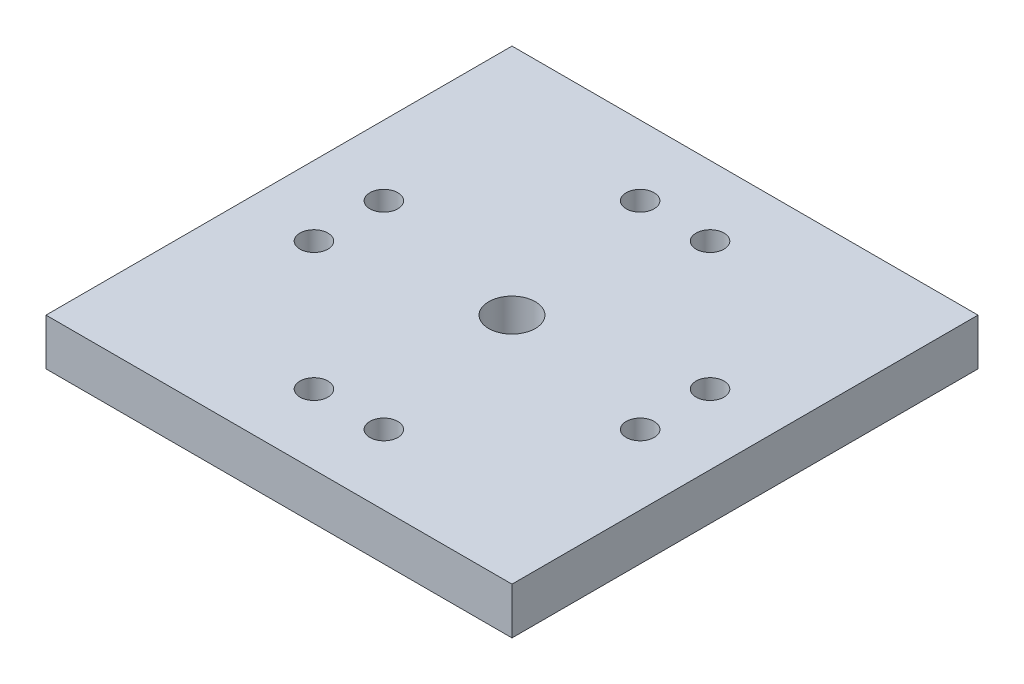
ISO-10303-21;
HEADER;
FILE_DESCRIPTION(('STEP AP214'),'2;1');
FILE_NAME('part.step','',(''),(''),'','','');
FILE_SCHEMA(('AUTOMOTIVE_DESIGN { 1 0 10303 214 1 1 1 1 }'));
ENDSEC;
DATA;
#1=APPLICATION_CONTEXT('core data for automotive mechanical design processes');
#2=APPLICATION_PROTOCOL_DEFINITION('international standard','automotive_design',2000,#1);
#3=PRODUCT_CONTEXT('',#1,'mechanical');
#4=PRODUCT('Part','Part','',(#3));
#5=PRODUCT_RELATED_PRODUCT_CATEGORY('part','',(#4));
#6=PRODUCT_DEFINITION_FORMATION('','',#4);
#7=PRODUCT_DEFINITION_CONTEXT('part definition',#1,'design');
#8=PRODUCT_DEFINITION('design','',#6,#7);
#9=PRODUCT_DEFINITION_SHAPE('','',#8);
#10=(LENGTH_UNIT() NAMED_UNIT(*) SI_UNIT(.MILLI.,.METRE.));
#11=(NAMED_UNIT(*) PLANE_ANGLE_UNIT() SI_UNIT($,.RADIAN.));
#12=(NAMED_UNIT(*) SI_UNIT($,.STERADIAN.) SOLID_ANGLE_UNIT());
#13=UNCERTAINTY_MEASURE_WITH_UNIT(LENGTH_MEASURE(1.E-05),#10,'distance_accuracy_value','');
#14=(GEOMETRIC_REPRESENTATION_CONTEXT(3) GLOBAL_UNCERTAINTY_ASSIGNED_CONTEXT((#13)) GLOBAL_UNIT_ASSIGNED_CONTEXT((#10,
#11,#12)) REPRESENTATION_CONTEXT('',''));
#15=CARTESIAN_POINT('',(0.,0.,0.));
#16=DIRECTION('',(0.,0.,1.));
#17=DIRECTION('',(1.,0.,0.));
#18=AXIS2_PLACEMENT_3D('',#15,#16,#17);
#19=CARTESIAN_POINT('',(0.,10.,0.));
#20=DIRECTION('',(0.,1.,0.));
#21=DIRECTION('',(0.,0.,1.));
#22=AXIS2_PLACEMENT_3D('',#19,#20,#21);
#23=PLANE('',#22);
#24=CARTESIAN_POINT('',(-35.0000000000001,10.,7.49999999999965));
#25=DIRECTION('',(0.,1.,0.));
#26=DIRECTION('',(0.,0.,1.));
#27=AXIS2_PLACEMENT_3D('',#24,#25,#26);
#28=CIRCLE('',#27,3.);
#29=CARTESIAN_POINT('',(-35.0000000000001,10.,10.4999999999996));
#30=VERTEX_POINT('',#29);
#31=EDGE_CURVE('E151',#30,#30,#28,.T.);
#32=ORIENTED_EDGE('',*,*,#31,.F.);
#33=EDGE_LOOP('',(#32));
#34=FACE_BOUND('',#33,.T.);
#35=CARTESIAN_POINT('',(7.49999999999977,10.,35.));
#36=DIRECTION('',(0.,1.,0.));
#37=DIRECTION('',(0.,0.,1.));
#38=AXIS2_PLACEMENT_3D('',#35,#36,#37);
#39=CIRCLE('',#38,3.);
#40=CARTESIAN_POINT('',(7.49999999999977,10.,38.0000000000001));
#41=VERTEX_POINT('',#40);
#42=EDGE_CURVE('E139',#41,#41,#39,.T.);
#43=ORIENTED_EDGE('',*,*,#42,.F.);
#44=EDGE_LOOP('',(#43));
#45=FACE_BOUND('',#44,.T.);
#46=CARTESIAN_POINT('',(35.,10.,-7.49999999999989));
#47=DIRECTION('',(0.,1.,0.));
#48=DIRECTION('',(0.,0.,1.));
#49=AXIS2_PLACEMENT_3D('',#46,#47,#48);
#50=CIRCLE('',#49,3.);
#51=CARTESIAN_POINT('',(35.,10.,-4.49999999999989));
#52=VERTEX_POINT('',#51);
#53=EDGE_CURVE('E127',#52,#52,#50,.T.);
#54=ORIENTED_EDGE('',*,*,#53,.F.);
#55=EDGE_LOOP('',(#54));
#56=FACE_BOUND('',#55,.T.);
#57=CARTESIAN_POINT('',(-7.50000000000001,10.,-35.));
#58=DIRECTION('',(0.,1.,0.));
#59=DIRECTION('',(0.,0.,1.));
#60=AXIS2_PLACEMENT_3D('',#57,#58,#59);
#61=CIRCLE('',#60,3.);
#62=CARTESIAN_POINT('',(-7.50000000000001,10.,-32.));
#63=VERTEX_POINT('',#62);
#64=EDGE_CURVE('E115',#63,#63,#61,.T.);
#65=ORIENTED_EDGE('',*,*,#64,.F.);
#66=EDGE_LOOP('',(#65));
#67=FACE_BOUND('',#66,.T.);
#68=DIRECTION('',(0.,0.,1.));
#69=VECTOR('',#68,1.);
#70=CARTESIAN_POINT('',(-50.,10.,50.));
#71=LINE('',#70,#69);
#72=CARTESIAN_POINT('',(-50.,10.,-50.));
#73=VERTEX_POINT('',#72);
#74=CARTESIAN_POINT('',(-50.,10.,50.));
#75=VERTEX_POINT('',#74);
#76=EDGE_CURVE('E85',#73,#75,#71,.T.);
#77=ORIENTED_EDGE('',*,*,#76,.T.);
#78=DIRECTION('',(1.,0.,0.));
#79=VECTOR('',#78,1.);
#80=CARTESIAN_POINT('',(50.,10.,50.));
#81=LINE('',#80,#79);
#82=CARTESIAN_POINT('',(50.,10.,50.));
#83=VERTEX_POINT('',#82);
#84=EDGE_CURVE('E80',#75,#83,#81,.T.);
#85=ORIENTED_EDGE('',*,*,#84,.T.);
#86=DIRECTION('',(0.,0.,-1.));
#87=VECTOR('',#86,1.);
#88=CARTESIAN_POINT('',(50.,10.,50.));
#89=LINE('',#88,#87);
#90=CARTESIAN_POINT('',(50.,10.,-50.));
#91=VERTEX_POINT('',#90);
#92=EDGE_CURVE('E83',#83,#91,#89,.T.);
#93=ORIENTED_EDGE('',*,*,#92,.T.);
#94=DIRECTION('',(-1.,0.,0.));
#95=VECTOR('',#94,1.);
#96=CARTESIAN_POINT('',(50.,10.,-50.));
#97=LINE('',#96,#95);
#98=EDGE_CURVE('E50',#91,#73,#97,.T.);
#99=ORIENTED_EDGE('',*,*,#98,.T.);
#100=EDGE_LOOP('',(#77,#85,#93,#99));
#101=FACE_BOUND('',#100,.T.);
#102=CARTESIAN_POINT('',(0.,10.,0.));
#103=DIRECTION('',(0.,1.,0.));
#104=DIRECTION('',(0.,0.,1.));
#105=AXIS2_PLACEMENT_3D('',#102,#103,#104);
#106=CIRCLE('',#105,5.);
#107=CARTESIAN_POINT('',(0.,10.,4.99999999999999));
#108=VERTEX_POINT('',#107);
#109=EDGE_CURVE('E100',#108,#108,#106,.T.);
#110=ORIENTED_EDGE('',*,*,#109,.F.);
#111=EDGE_LOOP('',(#110));
#112=FACE_BOUND('',#111,.T.);
#113=CARTESIAN_POINT('',(7.49999999999999,10.,-35.));
#114=DIRECTION('',(0.,1.,0.));
#115=DIRECTION('',(0.,0.,1.));
#116=AXIS2_PLACEMENT_3D('',#113,#114,#115);
#117=CIRCLE('',#116,3.);
#118=CARTESIAN_POINT('',(7.49999999999999,10.,-32.));
#119=VERTEX_POINT('',#118);
#120=EDGE_CURVE('E121',#119,#119,#117,.T.);
#121=ORIENTED_EDGE('',*,*,#120,.F.);
#122=EDGE_LOOP('',(#121));
#123=FACE_BOUND('',#122,.T.);
#124=CARTESIAN_POINT('',(35.,10.,7.50000000000011));
#125=DIRECTION('',(0.,1.,0.));
#126=DIRECTION('',(0.,0.,1.));
#127=AXIS2_PLACEMENT_3D('',#124,#125,#126);
#128=CIRCLE('',#127,3.);
#129=CARTESIAN_POINT('',(35.,10.,10.5000000000001));
#130=VERTEX_POINT('',#129);
#131=EDGE_CURVE('E133',#130,#130,#128,.T.);
#132=ORIENTED_EDGE('',*,*,#131,.F.);
#133=EDGE_LOOP('',(#132));
#134=FACE_BOUND('',#133,.T.);
#135=CARTESIAN_POINT('',(-7.50000000000023,10.,34.9999999999999));
#136=DIRECTION('',(0.,1.,0.));
#137=DIRECTION('',(0.,0.,1.));
#138=AXIS2_PLACEMENT_3D('',#135,#136,#137);
#139=CIRCLE('',#138,3.);
#140=CARTESIAN_POINT('',(-7.50000000000023,10.,37.9999999999999));
#141=VERTEX_POINT('',#140);
#142=EDGE_CURVE('E145',#141,#141,#139,.T.);
#143=ORIENTED_EDGE('',*,*,#142,.F.);
#144=EDGE_LOOP('',(#143));
#145=FACE_BOUND('',#144,.T.);
#146=CARTESIAN_POINT('',(-34.9999999999999,10.,-7.50000000000035));
#147=DIRECTION('',(0.,1.,0.));
#148=DIRECTION('',(0.,0.,1.));
#149=AXIS2_PLACEMENT_3D('',#146,#147,#148);
#150=CIRCLE('',#149,3.);
#151=CARTESIAN_POINT('',(-34.9999999999999,10.,-4.50000000000035));
#152=VERTEX_POINT('',#151);
#153=EDGE_CURVE('E157',#152,#152,#150,.T.);
#154=ORIENTED_EDGE('',*,*,#153,.F.);
#155=EDGE_LOOP('',(#154));
#156=FACE_BOUND('',#155,.T.);
#157=ADVANCED_FACE('F33',(#34,#45,#56,#67,#101,#112,#123,#134,#145,#156),#23,.T.);
#158=CARTESIAN_POINT('',(0.,0.,0.));
#159=DIRECTION('',(0.,1.,0.));
#160=DIRECTION('',(0.,0.,1.));
#161=AXIS2_PLACEMENT_3D('',#158,#159,#160);
#162=PLANE('',#161);
#163=DIRECTION('',(0.,0.,1.));
#164=VECTOR('',#163,1.);
#165=CARTESIAN_POINT('',(-50.,0.,50.));
#166=LINE('',#165,#164);
#167=CARTESIAN_POINT('',(-50.,0.,-50.));
#168=VERTEX_POINT('',#167);
#169=CARTESIAN_POINT('',(-50.,0.,50.));
#170=VERTEX_POINT('',#169);
#171=EDGE_CURVE('E97',#168,#170,#166,.T.);
#172=ORIENTED_EDGE('',*,*,#171,.F.);
#173=DIRECTION('',(-1.,0.,0.));
#174=VECTOR('',#173,1.);
#175=CARTESIAN_POINT('',(50.,0.,-50.));
#176=LINE('',#175,#174);
#177=CARTESIAN_POINT('',(50.,0.,-50.));
#178=VERTEX_POINT('',#177);
#179=EDGE_CURVE('E73',#178,#168,#176,.T.);
#180=ORIENTED_EDGE('',*,*,#179,.F.);
#181=DIRECTION('',(0.,0.,-1.));
#182=VECTOR('',#181,1.);
#183=CARTESIAN_POINT('',(50.,0.,50.));
#184=LINE('',#183,#182);
#185=CARTESIAN_POINT('',(50.,0.,50.));
#186=VERTEX_POINT('',#185);
#187=EDGE_CURVE('E67',#186,#178,#184,.T.);
#188=ORIENTED_EDGE('',*,*,#187,.F.);
#189=DIRECTION('',(1.,0.,0.));
#190=VECTOR('',#189,1.);
#191=CARTESIAN_POINT('',(50.,0.,50.));
#192=LINE('',#191,#190);
#193=EDGE_CURVE('E89',#170,#186,#192,.T.);
#194=ORIENTED_EDGE('',*,*,#193,.F.);
#195=EDGE_LOOP('',(#172,#180,#188,#194));
#196=FACE_BOUND('',#195,.T.);
#197=CARTESIAN_POINT('',(0.,0.,0.));
#198=DIRECTION('',(0.,1.,0.));
#199=DIRECTION('',(0.,0.,1.));
#200=AXIS2_PLACEMENT_3D('',#197,#198,#199);
#201=CIRCLE('',#200,5.);
#202=CARTESIAN_POINT('',(0.,0.,4.99999999999999));
#203=VERTEX_POINT('',#202);
#204=EDGE_CURVE('E112',#203,#203,#201,.T.);
#205=ORIENTED_EDGE('',*,*,#204,.T.);
#206=EDGE_LOOP('',(#205));
#207=FACE_BOUND('',#206,.T.);
#208=CARTESIAN_POINT('',(-7.50000000000001,0.,-35.));
#209=DIRECTION('',(0.,1.,0.));
#210=DIRECTION('',(0.,0.,1.));
#211=AXIS2_PLACEMENT_3D('',#208,#209,#210);
#212=CIRCLE('',#211,3.);
#213=CARTESIAN_POINT('',(-7.50000000000001,0.,-32.));
#214=VERTEX_POINT('',#213);
#215=EDGE_CURVE('E118',#214,#214,#212,.T.);
#216=ORIENTED_EDGE('',*,*,#215,.T.);
#217=EDGE_LOOP('',(#216));
#218=FACE_BOUND('',#217,.T.);
#219=CARTESIAN_POINT('',(7.49999999999999,0.,-35.));
#220=DIRECTION('',(0.,1.,0.));
#221=DIRECTION('',(0.,0.,1.));
#222=AXIS2_PLACEMENT_3D('',#219,#220,#221);
#223=CIRCLE('',#222,3.);
#224=CARTESIAN_POINT('',(7.49999999999999,0.,-32.));
#225=VERTEX_POINT('',#224);
#226=EDGE_CURVE('E124',#225,#225,#223,.T.);
#227=ORIENTED_EDGE('',*,*,#226,.T.);
#228=EDGE_LOOP('',(#227));
#229=FACE_BOUND('',#228,.T.);
#230=CARTESIAN_POINT('',(35.,0.,-7.49999999999989));
#231=DIRECTION('',(0.,1.,0.));
#232=DIRECTION('',(0.,0.,1.));
#233=AXIS2_PLACEMENT_3D('',#230,#231,#232);
#234=CIRCLE('',#233,3.);
#235=CARTESIAN_POINT('',(35.,0.,-4.49999999999989));
#236=VERTEX_POINT('',#235);
#237=EDGE_CURVE('E130',#236,#236,#234,.T.);
#238=ORIENTED_EDGE('',*,*,#237,.T.);
#239=EDGE_LOOP('',(#238));
#240=FACE_BOUND('',#239,.T.);
#241=CARTESIAN_POINT('',(35.,0.,7.50000000000011));
#242=DIRECTION('',(0.,1.,0.));
#243=DIRECTION('',(0.,0.,1.));
#244=AXIS2_PLACEMENT_3D('',#241,#242,#243);
#245=CIRCLE('',#244,3.);
#246=CARTESIAN_POINT('',(35.,0.,10.5000000000001));
#247=VERTEX_POINT('',#246);
#248=EDGE_CURVE('E136',#247,#247,#245,.T.);
#249=ORIENTED_EDGE('',*,*,#248,.T.);
#250=EDGE_LOOP('',(#249));
#251=FACE_BOUND('',#250,.T.);
#252=CARTESIAN_POINT('',(7.49999999999977,0.,35.));
#253=DIRECTION('',(0.,1.,0.));
#254=DIRECTION('',(0.,0.,1.));
#255=AXIS2_PLACEMENT_3D('',#252,#253,#254);
#256=CIRCLE('',#255,3.);
#257=CARTESIAN_POINT('',(7.49999999999977,0.,38.0000000000001));
#258=VERTEX_POINT('',#257);
#259=EDGE_CURVE('E142',#258,#258,#256,.T.);
#260=ORIENTED_EDGE('',*,*,#259,.T.);
#261=EDGE_LOOP('',(#260));
#262=FACE_BOUND('',#261,.T.);
#263=CARTESIAN_POINT('',(-7.50000000000023,0.,34.9999999999999));
#264=DIRECTION('',(0.,1.,0.));
#265=DIRECTION('',(0.,0.,1.));
#266=AXIS2_PLACEMENT_3D('',#263,#264,#265);
#267=CIRCLE('',#266,3.);
#268=CARTESIAN_POINT('',(-7.50000000000023,0.,37.9999999999999));
#269=VERTEX_POINT('',#268);
#270=EDGE_CURVE('E148',#269,#269,#267,.T.);
#271=ORIENTED_EDGE('',*,*,#270,.T.);
#272=EDGE_LOOP('',(#271));
#273=FACE_BOUND('',#272,.T.);
#274=CARTESIAN_POINT('',(-35.0000000000001,0.,7.49999999999965));
#275=DIRECTION('',(0.,1.,0.));
#276=DIRECTION('',(0.,0.,1.));
#277=AXIS2_PLACEMENT_3D('',#274,#275,#276);
#278=CIRCLE('',#277,3.);
#279=CARTESIAN_POINT('',(-35.0000000000001,0.,10.4999999999996));
#280=VERTEX_POINT('',#279);
#281=EDGE_CURVE('E154',#280,#280,#278,.T.);
#282=ORIENTED_EDGE('',*,*,#281,.T.);
#283=EDGE_LOOP('',(#282));
#284=FACE_BOUND('',#283,.T.);
#285=CARTESIAN_POINT('',(-34.9999999999999,0.,-7.50000000000035));
#286=DIRECTION('',(0.,1.,0.));
#287=DIRECTION('',(0.,0.,1.));
#288=AXIS2_PLACEMENT_3D('',#285,#286,#287);
#289=CIRCLE('',#288,3.);
#290=CARTESIAN_POINT('',(-34.9999999999999,0.,-4.50000000000035));
#291=VERTEX_POINT('',#290);
#292=EDGE_CURVE('E160',#291,#291,#289,.T.);
#293=ORIENTED_EDGE('',*,*,#292,.T.);
#294=EDGE_LOOP('',(#293));
#295=FACE_BOUND('',#294,.T.);
#296=ADVANCED_FACE('F108',(#196,#207,#218,#229,#240,#251,#262,#273,#284,#295),#162,.F.);
#297=CARTESIAN_POINT('',(-50.,10.,50.));
#298=DIRECTION('',(1.,0.,0.));
#299=DIRECTION('',(0.,0.,-1.));
#300=AXIS2_PLACEMENT_3D('',#297,#298,#299);
#301=PLANE('',#300);
#302=ORIENTED_EDGE('',*,*,#171,.T.);
#303=DIRECTION('',(0.,-1.,0.));
#304=VECTOR('',#303,1.);
#305=CARTESIAN_POINT('',(-50.,10.,50.));
#306=LINE('',#305,#304);
#307=EDGE_CURVE('E11',#75,#170,#306,.T.);
#308=ORIENTED_EDGE('',*,*,#307,.F.);
#309=ORIENTED_EDGE('',*,*,#76,.F.);
#310=DIRECTION('',(0.,-1.,0.));
#311=VECTOR('',#310,1.);
#312=CARTESIAN_POINT('',(-50.,10.,-50.));
#313=LINE('',#312,#311);
#314=EDGE_CURVE('E93',#73,#168,#313,.T.);
#315=ORIENTED_EDGE('',*,*,#314,.T.);
#316=EDGE_LOOP('',(#302,#308,#309,#315));
#317=FACE_BOUND('',#316,.T.);
#318=ADVANCED_FACE('F35',(#317),#301,.F.);
#319=CARTESIAN_POINT('',(50.,10.,50.));
#320=DIRECTION('',(0.,0.,-1.));
#321=DIRECTION('',(-1.,0.,0.));
#322=AXIS2_PLACEMENT_3D('',#319,#320,#321);
#323=PLANE('',#322);
#324=ORIENTED_EDGE('',*,*,#193,.T.);
#325=DIRECTION('',(0.,-1.,0.));
#326=VECTOR('',#325,1.);
#327=CARTESIAN_POINT('',(50.,10.,50.));
#328=LINE('',#327,#326);
#329=EDGE_CURVE('E42',#83,#186,#328,.T.);
#330=ORIENTED_EDGE('',*,*,#329,.F.);
#331=ORIENTED_EDGE('',*,*,#84,.F.);
#332=ORIENTED_EDGE('',*,*,#307,.T.);
#333=EDGE_LOOP('',(#324,#330,#331,#332));
#334=FACE_BOUND('',#333,.T.);
#335=ADVANCED_FACE('F88',(#334),#323,.F.);
#336=CARTESIAN_POINT('',(50.,10.,50.));
#337=DIRECTION('',(-1.,0.,0.));
#338=DIRECTION('',(0.,0.,1.));
#339=AXIS2_PLACEMENT_3D('',#336,#337,#338);
#340=PLANE('',#339);
#341=ORIENTED_EDGE('',*,*,#187,.T.);
#342=DIRECTION('',(0.,-1.,0.));
#343=VECTOR('',#342,1.);
#344=CARTESIAN_POINT('',(50.,10.,-50.));
#345=LINE('',#344,#343);
#346=EDGE_CURVE('E90',#91,#178,#345,.T.);
#347=ORIENTED_EDGE('',*,*,#346,.F.);
#348=ORIENTED_EDGE('',*,*,#92,.F.);
#349=ORIENTED_EDGE('',*,*,#329,.T.);
#350=EDGE_LOOP('',(#341,#347,#348,#349));
#351=FACE_BOUND('',#350,.T.);
#352=ADVANCED_FACE('F91',(#351),#340,.F.);
#353=CARTESIAN_POINT('',(50.,10.,-50.));
#354=DIRECTION('',(0.,0.,1.));
#355=DIRECTION('',(1.,0.,0.));
#356=AXIS2_PLACEMENT_3D('',#353,#354,#355);
#357=PLANE('',#356);
#358=ORIENTED_EDGE('',*,*,#179,.T.);
#359=ORIENTED_EDGE('',*,*,#314,.F.);
#360=ORIENTED_EDGE('',*,*,#98,.F.);
#361=ORIENTED_EDGE('',*,*,#346,.T.);
#362=EDGE_LOOP('',(#358,#359,#360,#361));
#363=FACE_BOUND('',#362,.T.);
#364=ADVANCED_FACE('F105',(#363),#357,.F.);
#365=CARTESIAN_POINT('',(0.,10.,0.));
#366=DIRECTION('',(0.,-1.,0.));
#367=DIRECTION('',(0.,0.,-1.));
#368=AXIS2_PLACEMENT_3D('',#365,#366,#367);
#369=CYLINDRICAL_SURFACE('',#368,5.);
#370=ORIENTED_EDGE('',*,*,#109,.T.);
#371=EDGE_LOOP('',(#370));
#372=FACE_BOUND('',#371,.T.);
#373=ORIENTED_EDGE('',*,*,#204,.F.);
#374=EDGE_LOOP('',(#373));
#375=FACE_BOUND('',#374,.T.);
#376=ADVANCED_FACE('F179',(#372,#375),#369,.F.);
#377=CARTESIAN_POINT('',(-7.50000000000001,10.,-35.));
#378=DIRECTION('',(0.,-1.,0.));
#379=DIRECTION('',(0.,0.,-1.));
#380=AXIS2_PLACEMENT_3D('',#377,#378,#379);
#381=CYLINDRICAL_SURFACE('',#380,3.);
#382=ORIENTED_EDGE('',*,*,#64,.T.);
#383=EDGE_LOOP('',(#382));
#384=FACE_BOUND('',#383,.T.);
#385=ORIENTED_EDGE('',*,*,#215,.F.);
#386=EDGE_LOOP('',(#385));
#387=FACE_BOUND('',#386,.T.);
#388=ADVANCED_FACE('F225',(#384,#387),#381,.F.);
#389=CARTESIAN_POINT('',(7.49999999999999,10.,-35.));
#390=DIRECTION('',(0.,-1.,0.));
#391=DIRECTION('',(0.,0.,-1.));
#392=AXIS2_PLACEMENT_3D('',#389,#390,#391);
#393=CYLINDRICAL_SURFACE('',#392,3.);
#394=ORIENTED_EDGE('',*,*,#120,.T.);
#395=EDGE_LOOP('',(#394));
#396=FACE_BOUND('',#395,.T.);
#397=ORIENTED_EDGE('',*,*,#226,.F.);
#398=EDGE_LOOP('',(#397));
#399=FACE_BOUND('',#398,.T.);
#400=ADVANCED_FACE('F233',(#396,#399),#393,.F.);
#401=CARTESIAN_POINT('',(35.,10.,-7.49999999999989));
#402=DIRECTION('',(0.,-1.,0.));
#403=DIRECTION('',(0.,0.,-1.));
#404=AXIS2_PLACEMENT_3D('',#401,#402,#403);
#405=CYLINDRICAL_SURFACE('',#404,3.);
#406=ORIENTED_EDGE('',*,*,#53,.T.);
#407=EDGE_LOOP('',(#406));
#408=FACE_BOUND('',#407,.T.);
#409=ORIENTED_EDGE('',*,*,#237,.F.);
#410=EDGE_LOOP('',(#409));
#411=FACE_BOUND('',#410,.T.);
#412=ADVANCED_FACE('F241',(#408,#411),#405,.F.);
#413=CARTESIAN_POINT('',(35.,10.,7.50000000000011));
#414=DIRECTION('',(0.,-1.,0.));
#415=DIRECTION('',(0.,0.,-1.));
#416=AXIS2_PLACEMENT_3D('',#413,#414,#415);
#417=CYLINDRICAL_SURFACE('',#416,3.);
#418=ORIENTED_EDGE('',*,*,#131,.T.);
#419=EDGE_LOOP('',(#418));
#420=FACE_BOUND('',#419,.T.);
#421=ORIENTED_EDGE('',*,*,#248,.F.);
#422=EDGE_LOOP('',(#421));
#423=FACE_BOUND('',#422,.T.);
#424=ADVANCED_FACE('F250',(#420,#423),#417,.F.);
#425=CARTESIAN_POINT('',(7.49999999999977,10.,35.));
#426=DIRECTION('',(0.,-1.,0.));
#427=DIRECTION('',(0.,0.,-1.));
#428=AXIS2_PLACEMENT_3D('',#425,#426,#427);
#429=CYLINDRICAL_SURFACE('',#428,3.);
#430=ORIENTED_EDGE('',*,*,#42,.T.);
#431=EDGE_LOOP('',(#430));
#432=FACE_BOUND('',#431,.T.);
#433=ORIENTED_EDGE('',*,*,#259,.F.);
#434=EDGE_LOOP('',(#433));
#435=FACE_BOUND('',#434,.T.);
#436=ADVANCED_FACE('F259',(#432,#435),#429,.F.);
#437=CARTESIAN_POINT('',(-7.50000000000023,10.,34.9999999999999));
#438=DIRECTION('',(0.,-1.,0.));
#439=DIRECTION('',(0.,0.,-1.));
#440=AXIS2_PLACEMENT_3D('',#437,#438,#439);
#441=CYLINDRICAL_SURFACE('',#440,3.);
#442=ORIENTED_EDGE('',*,*,#142,.T.);
#443=EDGE_LOOP('',(#442));
#444=FACE_BOUND('',#443,.T.);
#445=ORIENTED_EDGE('',*,*,#270,.F.);
#446=EDGE_LOOP('',(#445));
#447=FACE_BOUND('',#446,.T.);
#448=ADVANCED_FACE('F268',(#444,#447),#441,.F.);
#449=CARTESIAN_POINT('',(-35.0000000000001,10.,7.49999999999965));
#450=DIRECTION('',(0.,-1.,0.));
#451=DIRECTION('',(0.,0.,-1.));
#452=AXIS2_PLACEMENT_3D('',#449,#450,#451);
#453=CYLINDRICAL_SURFACE('',#452,3.);
#454=ORIENTED_EDGE('',*,*,#31,.T.);
#455=EDGE_LOOP('',(#454));
#456=FACE_BOUND('',#455,.T.);
#457=ORIENTED_EDGE('',*,*,#281,.F.);
#458=EDGE_LOOP('',(#457));
#459=FACE_BOUND('',#458,.T.);
#460=ADVANCED_FACE('F277',(#456,#459),#453,.F.);
#461=CARTESIAN_POINT('',(-34.9999999999999,10.,-7.50000000000035));
#462=DIRECTION('',(0.,-1.,0.));
#463=DIRECTION('',(0.,0.,-1.));
#464=AXIS2_PLACEMENT_3D('',#461,#462,#463);
#465=CYLINDRICAL_SURFACE('',#464,3.);
#466=ORIENTED_EDGE('',*,*,#153,.T.);
#467=EDGE_LOOP('',(#466));
#468=FACE_BOUND('',#467,.T.);
#469=ORIENTED_EDGE('',*,*,#292,.F.);
#470=EDGE_LOOP('',(#469));
#471=FACE_BOUND('',#470,.T.);
#472=ADVANCED_FACE('F166',(#468,#471),#465,.F.);
#473=CLOSED_SHELL('',(#157,#296,#318,#335,#352,#364,#376,#388,#400,#412,#424,#436,#448,#460,#472));
#474=MANIFOLD_SOLID_BREP('B2',#473);
#475=ADVANCED_BREP_SHAPE_REPRESENTATION('',(#18,#474),#14);
#476=SHAPE_DEFINITION_REPRESENTATION(#9,#475);
ENDSEC;
END-ISO-10303-21;
